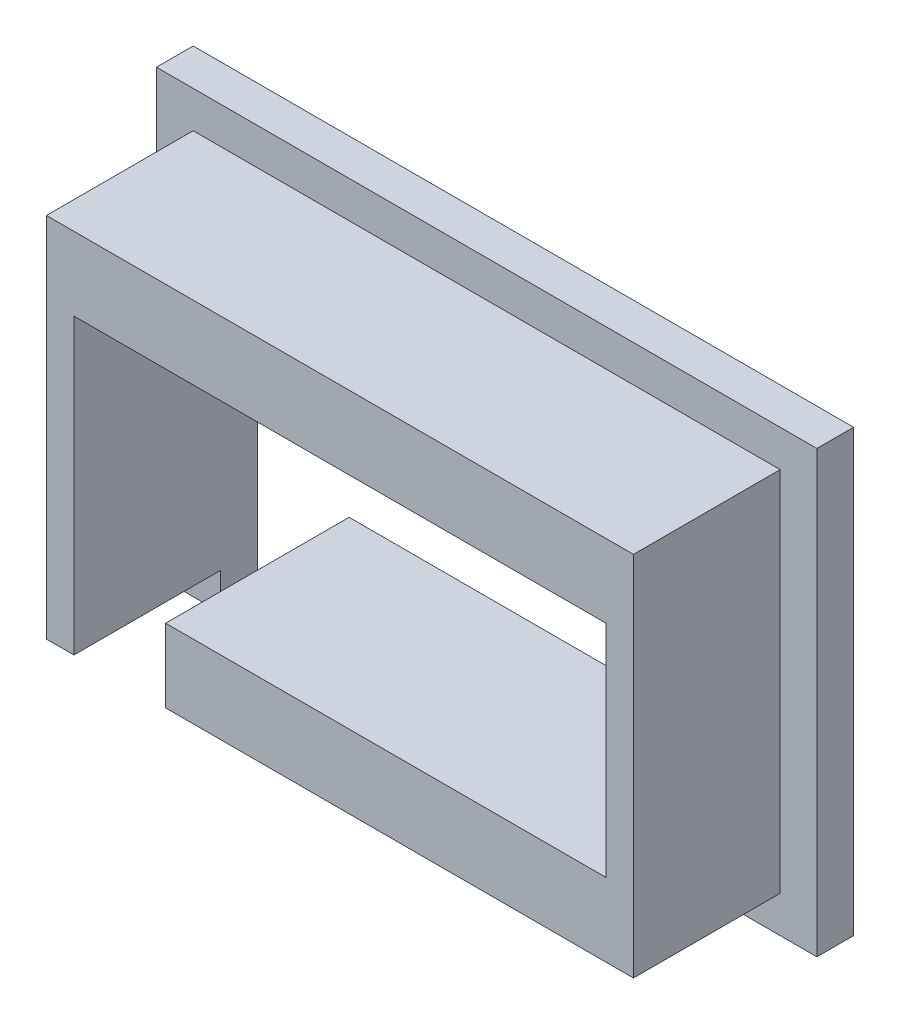
ISO-10303-21;
HEADER;
FILE_DESCRIPTION(('STEP AP214'),'2;1');
FILE_NAME('part.step','',(''),(''),'','','');
FILE_SCHEMA(('AUTOMOTIVE_DESIGN { 1 0 10303 214 1 1 1 1 }'));
ENDSEC;
DATA;
#1=APPLICATION_CONTEXT('core data for automotive mechanical design processes');
#2=APPLICATION_PROTOCOL_DEFINITION('international standard','automotive_design',2000,#1);
#3=PRODUCT_CONTEXT('',#1,'mechanical');
#4=PRODUCT('Part','Part','',(#3));
#5=PRODUCT_RELATED_PRODUCT_CATEGORY('part','',(#4));
#6=PRODUCT_DEFINITION_FORMATION('','',#4);
#7=PRODUCT_DEFINITION_CONTEXT('part definition',#1,'design');
#8=PRODUCT_DEFINITION('design','',#6,#7);
#9=PRODUCT_DEFINITION_SHAPE('','',#8);
#10=(LENGTH_UNIT() NAMED_UNIT(*) SI_UNIT(.MILLI.,.METRE.));
#11=(NAMED_UNIT(*) PLANE_ANGLE_UNIT() SI_UNIT($,.RADIAN.));
#12=(NAMED_UNIT(*) SI_UNIT($,.STERADIAN.) SOLID_ANGLE_UNIT());
#13=UNCERTAINTY_MEASURE_WITH_UNIT(LENGTH_MEASURE(1.E-05),#10,'distance_accuracy_value','');
#14=(GEOMETRIC_REPRESENTATION_CONTEXT(3) GLOBAL_UNCERTAINTY_ASSIGNED_CONTEXT((#13)) GLOBAL_UNIT_ASSIGNED_CONTEXT((#10,
#11,#12)) REPRESENTATION_CONTEXT('',''));
#15=CARTESIAN_POINT('',(0.,0.,0.));
#16=DIRECTION('',(0.,0.,1.));
#17=DIRECTION('',(1.,0.,0.));
#18=AXIS2_PLACEMENT_3D('',#15,#16,#17);
#19=CARTESIAN_POINT('',(-16.,-10.,10.));
#20=DIRECTION('',(0.,1.,0.));
#21=DIRECTION('',(0.,0.,1.));
#22=AXIS2_PLACEMENT_3D('',#19,#20,#21);
#23=PLANE('',#22);
#24=DIRECTION('',(1.,0.,0.));
#25=VECTOR('',#24,1.);
#26=CARTESIAN_POINT('',(-16.,-10.,2.));
#27=LINE('',#26,#25);
#28=CARTESIAN_POINT('',(-16.,-10.,2.));
#29=VERTEX_POINT('',#28);
#30=CARTESIAN_POINT('',(-14.5,-10.,2.));
#31=VERTEX_POINT('',#30);
#32=EDGE_CURVE('E297',#29,#31,#27,.T.);
#33=ORIENTED_EDGE('',*,*,#32,.T.);
#34=DIRECTION('',(0.,0.,1.));
#35=VECTOR('',#34,1.);
#36=CARTESIAN_POINT('',(-14.5,-10.,10.));
#37=LINE('',#36,#35);
#38=CARTESIAN_POINT('',(-14.5,-10.,10.));
#39=VERTEX_POINT('',#38);
#40=EDGE_CURVE('E84',#31,#39,#37,.T.);
#41=ORIENTED_EDGE('',*,*,#40,.T.);
#42=DIRECTION('',(1.,0.,0.));
#43=VECTOR('',#42,1.);
#44=CARTESIAN_POINT('',(-16.,-10.,10.));
#45=LINE('',#44,#43);
#46=CARTESIAN_POINT('',(-16.,-10.,10.));
#47=VERTEX_POINT('',#46);
#48=EDGE_CURVE('E227',#47,#39,#45,.T.);
#49=ORIENTED_EDGE('',*,*,#48,.F.);
#50=DIRECTION('',(0.,0.,-1.));
#51=VECTOR('',#50,1.);
#52=CARTESIAN_POINT('',(-16.,-10.,10.));
#53=LINE('',#52,#51);
#54=EDGE_CURVE('E232',#47,#29,#53,.T.);
#55=ORIENTED_EDGE('',*,*,#54,.T.);
#56=EDGE_LOOP('',(#33,#41,#49,#55));
#57=FACE_BOUND('',#56,.T.);
#58=ADVANCED_FACE('F61',(#57),#23,.F.);
#59=CARTESIAN_POINT('',(-18.,-12.,2.));
#60=DIRECTION('',(0.,1.,0.));
#61=DIRECTION('',(0.,0.,1.));
#62=AXIS2_PLACEMENT_3D('',#59,#60,#61);
#63=PLANE('',#62);
#64=DIRECTION('',(1.,0.,0.));
#65=VECTOR('',#64,1.);
#66=CARTESIAN_POINT('',(-18.,-12.,0.));
#67=LINE('',#66,#65);
#68=CARTESIAN_POINT('',(-18.,-12.,0.));
#69=VERTEX_POINT('',#68);
#70=CARTESIAN_POINT('',(-14.5,-12.,0.));
#71=VERTEX_POINT('',#70);
#72=EDGE_CURVE('E273',#69,#71,#67,.T.);
#73=ORIENTED_EDGE('',*,*,#72,.T.);
#74=DIRECTION('',(0.,0.,-1.));
#75=VECTOR('',#74,1.);
#76=CARTESIAN_POINT('',(-14.5,-12.,10.));
#77=LINE('',#76,#75);
#78=CARTESIAN_POINT('',(-14.5,-12.,2.));
#79=VERTEX_POINT('',#78);
#80=EDGE_CURVE('E303',#79,#71,#77,.T.);
#81=ORIENTED_EDGE('',*,*,#80,.F.);
#82=DIRECTION('',(1.,0.,0.));
#83=VECTOR('',#82,1.);
#84=CARTESIAN_POINT('',(-18.,-12.,2.));
#85=LINE('',#84,#83);
#86=CARTESIAN_POINT('',(-18.,-12.,2.));
#87=VERTEX_POINT('',#86);
#88=EDGE_CURVE('E254',#87,#79,#85,.T.);
#89=ORIENTED_EDGE('',*,*,#88,.F.);
#90=DIRECTION('',(0.,0.,-1.));
#91=VECTOR('',#90,1.);
#92=CARTESIAN_POINT('',(-18.,-12.,2.));
#93=LINE('',#92,#91);
#94=EDGE_CURVE('E209',#87,#69,#93,.T.);
#95=ORIENTED_EDGE('',*,*,#94,.T.);
#96=EDGE_LOOP('',(#73,#81,#89,#95));
#97=FACE_BOUND('',#96,.T.);
#98=ADVANCED_FACE('F325',(#97),#63,.F.);
#99=CARTESIAN_POINT('',(16.,10.,10.));
#100=DIRECTION('',(-1.,0.,0.));
#101=DIRECTION('',(0.,0.,1.));
#102=AXIS2_PLACEMENT_3D('',#99,#100,#101);
#103=PLANE('',#102);
#104=DIRECTION('',(0.,1.,0.));
#105=VECTOR('',#104,1.);
#106=CARTESIAN_POINT('',(16.,-10.,2.));
#107=LINE('',#106,#105);
#108=CARTESIAN_POINT('',(16.,-10.,2.));
#109=VERTEX_POINT('',#108);
#110=CARTESIAN_POINT('',(16.,10.,2.));
#111=VERTEX_POINT('',#110);
#112=EDGE_CURVE('E301',#109,#111,#107,.T.);
#113=ORIENTED_EDGE('',*,*,#112,.T.);
#114=DIRECTION('',(0.,0.,-1.));
#115=VECTOR('',#114,1.);
#116=CARTESIAN_POINT('',(16.,10.,10.));
#117=LINE('',#116,#115);
#118=CARTESIAN_POINT('',(16.,10.,10.));
#119=VERTEX_POINT('',#118);
#120=EDGE_CURVE('E237',#119,#111,#117,.T.);
#121=ORIENTED_EDGE('',*,*,#120,.F.);
#122=DIRECTION('',(0.,1.,0.));
#123=VECTOR('',#122,1.);
#124=CARTESIAN_POINT('',(16.,10.,10.));
#125=LINE('',#124,#123);
#126=CARTESIAN_POINT('',(16.,-10.,10.));
#127=VERTEX_POINT('',#126);
#128=EDGE_CURVE('E219',#127,#119,#125,.T.);
#129=ORIENTED_EDGE('',*,*,#128,.F.);
#130=DIRECTION('',(0.,0.,-1.));
#131=VECTOR('',#130,1.);
#132=CARTESIAN_POINT('',(16.,-10.,10.));
#133=LINE('',#132,#131);
#134=EDGE_CURVE('E229',#127,#109,#133,.T.);
#135=ORIENTED_EDGE('',*,*,#134,.T.);
#136=EDGE_LOOP('',(#113,#121,#129,#135));
#137=FACE_BOUND('',#136,.T.);
#138=ADVANCED_FACE('F63',(#137),#103,.F.);
#139=CARTESIAN_POINT('',(-16.,10.,10.));
#140=DIRECTION('',(0.,-1.,0.));
#141=DIRECTION('',(0.,0.,-1.));
#142=AXIS2_PLACEMENT_3D('',#139,#140,#141);
#143=PLANE('',#142);
#144=DIRECTION('',(1.,0.,0.));
#145=VECTOR('',#144,1.);
#146=CARTESIAN_POINT('',(-16.,10.,2.));
#147=LINE('',#146,#145);
#148=CARTESIAN_POINT('',(-16.,10.,2.));
#149=VERTEX_POINT('',#148);
#150=EDGE_CURVE('E298',#149,#111,#147,.T.);
#151=ORIENTED_EDGE('',*,*,#150,.F.);
#152=DIRECTION('',(0.,0.,-1.));
#153=VECTOR('',#152,1.);
#154=CARTESIAN_POINT('',(-16.,10.,10.));
#155=LINE('',#154,#153);
#156=CARTESIAN_POINT('',(-16.,10.,10.));
#157=VERTEX_POINT('',#156);
#158=EDGE_CURVE('E234',#157,#149,#155,.T.);
#159=ORIENTED_EDGE('',*,*,#158,.F.);
#160=DIRECTION('',(-1.,0.,0.));
#161=VECTOR('',#160,1.);
#162=CARTESIAN_POINT('',(-16.,10.,10.));
#163=LINE('',#162,#161);
#164=EDGE_CURVE('E222',#119,#157,#163,.T.);
#165=ORIENTED_EDGE('',*,*,#164,.F.);
#166=ORIENTED_EDGE('',*,*,#120,.T.);
#167=EDGE_LOOP('',(#151,#159,#165,#166));
#168=FACE_BOUND('',#167,.T.);
#169=ADVANCED_FACE('F356',(#168),#143,.F.);
#170=CARTESIAN_POINT('',(-16.,10.,10.));
#171=DIRECTION('',(1.,0.,0.));
#172=DIRECTION('',(0.,1.,0.));
#173=AXIS2_PLACEMENT_3D('',#170,#171,#172);
#174=PLANE('',#173);
#175=DIRECTION('',(0.,1.,0.));
#176=VECTOR('',#175,1.);
#177=CARTESIAN_POINT('',(-16.,-10.,2.));
#178=LINE('',#177,#176);
#179=EDGE_CURVE('E266',#29,#149,#178,.T.);
#180=ORIENTED_EDGE('',*,*,#179,.F.);
#181=ORIENTED_EDGE('',*,*,#54,.F.);
#182=DIRECTION('',(0.,-1.,0.));
#183=VECTOR('',#182,1.);
#184=CARTESIAN_POINT('',(-16.,10.,10.));
#185=LINE('',#184,#183);
#186=EDGE_CURVE('E224',#157,#47,#185,.T.);
#187=ORIENTED_EDGE('',*,*,#186,.F.);
#188=ORIENTED_EDGE('',*,*,#158,.T.);
#189=EDGE_LOOP('',(#180,#181,#187,#188));
#190=FACE_BOUND('',#189,.T.);
#191=ADVANCED_FACE('F350',(#190),#174,.F.);
#192=CARTESIAN_POINT('',(-9.5,-10.,10.));
#193=VERTEX_POINT('',#192);
#194=EDGE_CURVE('E226',#193,#127,#45,.T.);
#195=ORIENTED_EDGE('',*,*,#194,.F.);
#196=DIRECTION('',(0.,0.,-1.));
#197=VECTOR('',#196,1.);
#198=CARTESIAN_POINT('',(-9.5,-10.,10.));
#199=LINE('',#198,#197);
#200=CARTESIAN_POINT('',(-9.5,-10.,2.));
#201=VERTEX_POINT('',#200);
#202=EDGE_CURVE('E177',#193,#201,#199,.T.);
#203=ORIENTED_EDGE('',*,*,#202,.T.);
#204=EDGE_CURVE('E247',#201,#109,#27,.T.);
#205=ORIENTED_EDGE('',*,*,#204,.T.);
#206=ORIENTED_EDGE('',*,*,#134,.F.);
#207=EDGE_LOOP('',(#195,#203,#205,#206));
#208=FACE_BOUND('',#207,.T.);
#209=ADVANCED_FACE('F343',(#208),#23,.F.);
#210=CARTESIAN_POINT('',(0.,0.,10.));
#211=DIRECTION('',(0.,0.,1.));
#212=DIRECTION('',(1.,0.,0.));
#213=AXIS2_PLACEMENT_3D('',#210,#211,#212);
#214=PLANE('',#213);
#215=ORIENTED_EDGE('',*,*,#48,.T.);
#216=DIRECTION('',(0.,-1.,0.));
#217=VECTOR('',#216,1.);
#218=CARTESIAN_POINT('',(-14.5,6.,10.));
#219=LINE('',#218,#217);
#220=CARTESIAN_POINT('',(-14.5,6.,10.));
#221=VERTEX_POINT('',#220);
#222=EDGE_CURVE('E197',#221,#39,#219,.T.);
#223=ORIENTED_EDGE('',*,*,#222,.F.);
#224=DIRECTION('',(-1.,0.,0.));
#225=VECTOR('',#224,1.);
#226=CARTESIAN_POINT('',(-14.5,6.,10.));
#227=LINE('',#226,#225);
#228=CARTESIAN_POINT('',(14.5,6.,10.));
#229=VERTEX_POINT('',#228);
#230=EDGE_CURVE('E201',#229,#221,#227,.T.);
#231=ORIENTED_EDGE('',*,*,#230,.F.);
#232=DIRECTION('',(0.,1.,0.));
#233=VECTOR('',#232,1.);
#234=CARTESIAN_POINT('',(14.5,6.,10.));
#235=LINE('',#234,#233);
#236=CARTESIAN_POINT('',(14.5,-6.,10.));
#237=VERTEX_POINT('',#236);
#238=EDGE_CURVE('E195',#237,#229,#235,.T.);
#239=ORIENTED_EDGE('',*,*,#238,.F.);
#240=DIRECTION('',(1.,0.,0.));
#241=VECTOR('',#240,1.);
#242=CARTESIAN_POINT('',(-14.5,-6.,10.));
#243=LINE('',#242,#241);
#244=CARTESIAN_POINT('',(-9.5,-6.,10.));
#245=VERTEX_POINT('',#244);
#246=EDGE_CURVE('E187',#245,#237,#243,.T.);
#247=ORIENTED_EDGE('',*,*,#246,.F.);
#248=DIRECTION('',(0.,-1.,0.));
#249=VECTOR('',#248,1.);
#250=CARTESIAN_POINT('',(-9.5,-12.,10.));
#251=LINE('',#250,#249);
#252=EDGE_CURVE('E171',#245,#193,#251,.T.);
#253=ORIENTED_EDGE('',*,*,#252,.T.);
#254=ORIENTED_EDGE('',*,*,#194,.T.);
#255=ORIENTED_EDGE('',*,*,#128,.T.);
#256=ORIENTED_EDGE('',*,*,#164,.T.);
#257=ORIENTED_EDGE('',*,*,#186,.T.);
#258=EDGE_LOOP('',(#215,#223,#231,#239,#247,#253,#254,#255,#256,#257));
#259=FACE_BOUND('',#258,.T.);
#260=ADVANCED_FACE('F193',(#259),#214,.T.);
#261=CARTESIAN_POINT('',(0.,0.,0.));
#262=DIRECTION('',(0.,0.,1.));
#263=DIRECTION('',(1.,0.,0.));
#264=AXIS2_PLACEMENT_3D('',#261,#262,#263);
#265=PLANE('',#264);
#266=DIRECTION('',(0.,-1.,0.));
#267=VECTOR('',#266,1.);
#268=CARTESIAN_POINT('',(-14.5,6.,0.));
#269=LINE('',#268,#267);
#270=CARTESIAN_POINT('',(-14.5,6.,0.));
#271=VERTEX_POINT('',#270);
#272=EDGE_CURVE('E212',#271,#71,#269,.T.);
#273=ORIENTED_EDGE('',*,*,#272,.T.);
#274=ORIENTED_EDGE('',*,*,#72,.F.);
#275=DIRECTION('',(0.,1.,0.));
#276=VECTOR('',#275,1.);
#277=CARTESIAN_POINT('',(-18.,-12.,0.));
#278=LINE('',#277,#276);
#279=CARTESIAN_POINT('',(-18.,12.,0.));
#280=VERTEX_POINT('',#279);
#281=EDGE_CURVE('E262',#69,#280,#278,.T.);
#282=ORIENTED_EDGE('',*,*,#281,.T.);
#283=DIRECTION('',(1.,0.,0.));
#284=VECTOR('',#283,1.);
#285=CARTESIAN_POINT('',(-18.,12.,0.));
#286=LINE('',#285,#284);
#287=CARTESIAN_POINT('',(18.,12.,0.));
#288=VERTEX_POINT('',#287);
#289=EDGE_CURVE('E265',#280,#288,#286,.T.);
#290=ORIENTED_EDGE('',*,*,#289,.T.);
#291=DIRECTION('',(0.,1.,0.));
#292=VECTOR('',#291,1.);
#293=CARTESIAN_POINT('',(18.,-12.,0.));
#294=LINE('',#293,#292);
#295=CARTESIAN_POINT('',(18.,-12.,0.));
#296=VERTEX_POINT('',#295);
#297=EDGE_CURVE('E269',#296,#288,#294,.T.);
#298=ORIENTED_EDGE('',*,*,#297,.F.);
#299=CARTESIAN_POINT('',(-9.5,-12.,0.));
#300=VERTEX_POINT('',#299);
#301=EDGE_CURVE('E272',#300,#296,#67,.T.);
#302=ORIENTED_EDGE('',*,*,#301,.F.);
#303=DIRECTION('',(0.,-1.,0.));
#304=VECTOR('',#303,1.);
#305=CARTESIAN_POINT('',(-9.5,-12.,0.));
#306=LINE('',#305,#304);
#307=CARTESIAN_POINT('',(-9.5,-6.,0.));
#308=VERTEX_POINT('',#307);
#309=EDGE_CURVE('E181',#308,#300,#306,.T.);
#310=ORIENTED_EDGE('',*,*,#309,.F.);
#311=DIRECTION('',(1.,0.,0.));
#312=VECTOR('',#311,1.);
#313=CARTESIAN_POINT('',(-14.5,-6.,0.));
#314=LINE('',#313,#312);
#315=CARTESIAN_POINT('',(14.5,-6.,0.));
#316=VERTEX_POINT('',#315);
#317=EDGE_CURVE('E189',#308,#316,#314,.T.);
#318=ORIENTED_EDGE('',*,*,#317,.T.);
#319=DIRECTION('',(0.,1.,0.));
#320=VECTOR('',#319,1.);
#321=CARTESIAN_POINT('',(14.5,6.,0.));
#322=LINE('',#321,#320);
#323=CARTESIAN_POINT('',(14.5,6.,0.));
#324=VERTEX_POINT('',#323);
#325=EDGE_CURVE('E205',#316,#324,#322,.T.);
#326=ORIENTED_EDGE('',*,*,#325,.T.);
#327=DIRECTION('',(-1.,0.,0.));
#328=VECTOR('',#327,1.);
#329=CARTESIAN_POINT('',(-14.5,6.,0.));
#330=LINE('',#329,#328);
#331=EDGE_CURVE('E208',#324,#271,#330,.T.);
#332=ORIENTED_EDGE('',*,*,#331,.T.);
#333=EDGE_LOOP('',(#273,#274,#282,#290,#298,#302,#310,#318,#326,#332));
#334=FACE_BOUND('',#333,.T.);
#335=ADVANCED_FACE('F328',(#334),#265,.F.);
#336=CARTESIAN_POINT('',(14.5,6.,10.));
#337=DIRECTION('',(-1.,0.,0.));
#338=DIRECTION('',(0.,0.,1.));
#339=AXIS2_PLACEMENT_3D('',#336,#337,#338);
#340=PLANE('',#339);
#341=ORIENTED_EDGE('',*,*,#325,.F.);
#342=DIRECTION('',(0.,0.,-1.));
#343=VECTOR('',#342,1.);
#344=CARTESIAN_POINT('',(14.5,-6.,10.));
#345=LINE('',#344,#343);
#346=EDGE_CURVE('E196',#237,#316,#345,.T.);
#347=ORIENTED_EDGE('',*,*,#346,.F.);
#348=ORIENTED_EDGE('',*,*,#238,.T.);
#349=DIRECTION('',(0.,0.,-1.));
#350=VECTOR('',#349,1.);
#351=CARTESIAN_POINT('',(14.5,6.,10.));
#352=LINE('',#351,#350);
#353=EDGE_CURVE('E216',#229,#324,#352,.T.);
#354=ORIENTED_EDGE('',*,*,#353,.T.);
#355=EDGE_LOOP('',(#341,#347,#348,#354));
#356=FACE_BOUND('',#355,.T.);
#357=ADVANCED_FACE('F331',(#356),#340,.T.);
#358=CARTESIAN_POINT('',(-14.5,6.,10.));
#359=DIRECTION('',(0.,-1.,0.));
#360=DIRECTION('',(0.,0.,-1.));
#361=AXIS2_PLACEMENT_3D('',#358,#359,#360);
#362=PLANE('',#361);
#363=ORIENTED_EDGE('',*,*,#331,.F.);
#364=ORIENTED_EDGE('',*,*,#353,.F.);
#365=ORIENTED_EDGE('',*,*,#230,.T.);
#366=DIRECTION('',(0.,0.,-1.));
#367=VECTOR('',#366,1.);
#368=CARTESIAN_POINT('',(-14.5,6.,10.));
#369=LINE('',#368,#367);
#370=EDGE_CURVE('E199',#221,#271,#369,.T.);
#371=ORIENTED_EDGE('',*,*,#370,.T.);
#372=EDGE_LOOP('',(#363,#364,#365,#371));
#373=FACE_BOUND('',#372,.T.);
#374=ADVANCED_FACE('F285',(#373),#362,.T.);
#375=CARTESIAN_POINT('',(-14.5,6.,10.));
#376=DIRECTION('',(1.,0.,0.));
#377=DIRECTION('',(0.,0.,-1.));
#378=AXIS2_PLACEMENT_3D('',#375,#376,#377);
#379=PLANE('',#378);
#380=ORIENTED_EDGE('',*,*,#272,.F.);
#381=ORIENTED_EDGE('',*,*,#370,.F.);
#382=ORIENTED_EDGE('',*,*,#222,.T.);
#383=ORIENTED_EDGE('',*,*,#40,.F.);
#384=DIRECTION('',(0.,1.,0.));
#385=VECTOR('',#384,1.);
#386=CARTESIAN_POINT('',(-14.5,0.,2.));
#387=LINE('',#386,#385);
#388=EDGE_CURVE('E12',#79,#31,#387,.T.);
#389=ORIENTED_EDGE('',*,*,#388,.F.);
#390=ORIENTED_EDGE('',*,*,#80,.T.);
#391=EDGE_LOOP('',(#380,#381,#382,#383,#389,#390));
#392=FACE_BOUND('',#391,.T.);
#393=ADVANCED_FACE('F288',(#392),#379,.T.);
#394=CARTESIAN_POINT('',(-14.5,-6.,10.));
#395=DIRECTION('',(0.,1.,0.));
#396=DIRECTION('',(0.,0.,1.));
#397=AXIS2_PLACEMENT_3D('',#394,#395,#396);
#398=PLANE('',#397);
#399=DIRECTION('',(0.,0.,-1.));
#400=VECTOR('',#399,1.);
#401=CARTESIAN_POINT('',(-9.5,-6.,10.));
#402=LINE('',#401,#400);
#403=EDGE_CURVE('E174',#245,#308,#402,.T.);
#404=ORIENTED_EDGE('',*,*,#403,.F.);
#405=ORIENTED_EDGE('',*,*,#246,.T.);
#406=ORIENTED_EDGE('',*,*,#346,.T.);
#407=ORIENTED_EDGE('',*,*,#317,.F.);
#408=EDGE_LOOP('',(#404,#405,#406,#407));
#409=FACE_BOUND('',#408,.T.);
#410=ADVANCED_FACE('F185',(#409),#398,.T.);
#411=CARTESIAN_POINT('',(-18.,-12.,2.));
#412=DIRECTION('',(-1.,0.,0.));
#413=DIRECTION('',(0.,0.,1.));
#414=AXIS2_PLACEMENT_3D('',#411,#412,#413);
#415=PLANE('',#414);
#416=ORIENTED_EDGE('',*,*,#281,.F.);
#417=ORIENTED_EDGE('',*,*,#94,.F.);
#418=DIRECTION('',(0.,1.,0.));
#419=VECTOR('',#418,1.);
#420=CARTESIAN_POINT('',(-18.,-12.,2.));
#421=LINE('',#420,#419);
#422=CARTESIAN_POINT('',(-18.,12.,2.));
#423=VERTEX_POINT('',#422);
#424=EDGE_CURVE('E276',#87,#423,#421,.T.);
#425=ORIENTED_EDGE('',*,*,#424,.T.);
#426=DIRECTION('',(0.,0.,-1.));
#427=VECTOR('',#426,1.);
#428=CARTESIAN_POINT('',(-18.,12.,2.));
#429=LINE('',#428,#427);
#430=EDGE_CURVE('E257',#423,#280,#429,.T.);
#431=ORIENTED_EDGE('',*,*,#430,.T.);
#432=EDGE_LOOP('',(#416,#417,#425,#431));
#433=FACE_BOUND('',#432,.T.);
#434=ADVANCED_FACE('F320',(#433),#415,.T.);
#435=CARTESIAN_POINT('',(-9.5,-12.,2.));
#436=VERTEX_POINT('',#435);
#437=CARTESIAN_POINT('',(18.,-12.,2.));
#438=VERTEX_POINT('',#437);
#439=EDGE_CURVE('E244',#436,#438,#85,.T.);
#440=ORIENTED_EDGE('',*,*,#439,.F.);
#441=DIRECTION('',(0.,0.,-1.));
#442=VECTOR('',#441,1.);
#443=CARTESIAN_POINT('',(-9.5,-12.,10.));
#444=LINE('',#443,#442);
#445=EDGE_CURVE('E76',#436,#300,#444,.T.);
#446=ORIENTED_EDGE('',*,*,#445,.T.);
#447=ORIENTED_EDGE('',*,*,#301,.T.);
#448=DIRECTION('',(0.,0.,-1.));
#449=VECTOR('',#448,1.);
#450=CARTESIAN_POINT('',(18.,-12.,2.));
#451=LINE('',#450,#449);
#452=EDGE_CURVE('E252',#438,#296,#451,.T.);
#453=ORIENTED_EDGE('',*,*,#452,.F.);
#454=EDGE_LOOP('',(#440,#446,#447,#453));
#455=FACE_BOUND('',#454,.T.);
#456=ADVANCED_FACE('F249',(#455),#63,.F.);
#457=CARTESIAN_POINT('',(18.,-12.,2.));
#458=DIRECTION('',(-1.,0.,0.));
#459=DIRECTION('',(0.,-1.,0.));
#460=AXIS2_PLACEMENT_3D('',#457,#458,#459);
#461=PLANE('',#460);
#462=ORIENTED_EDGE('',*,*,#297,.T.);
#463=DIRECTION('',(0.,0.,-1.));
#464=VECTOR('',#463,1.);
#465=CARTESIAN_POINT('',(18.,12.,2.));
#466=LINE('',#465,#464);
#467=CARTESIAN_POINT('',(18.,12.,2.));
#468=VERTEX_POINT('',#467);
#469=EDGE_CURVE('E279',#468,#288,#466,.T.);
#470=ORIENTED_EDGE('',*,*,#469,.F.);
#471=DIRECTION('',(0.,1.,0.));
#472=VECTOR('',#471,1.);
#473=CARTESIAN_POINT('',(18.,-12.,2.));
#474=LINE('',#473,#472);
#475=EDGE_CURVE('E255',#438,#468,#474,.T.);
#476=ORIENTED_EDGE('',*,*,#475,.F.);
#477=ORIENTED_EDGE('',*,*,#452,.T.);
#478=EDGE_LOOP('',(#462,#470,#476,#477));
#479=FACE_BOUND('',#478,.T.);
#480=ADVANCED_FACE('F430',(#479),#461,.F.);
#481=CARTESIAN_POINT('',(-18.,12.,2.));
#482=DIRECTION('',(0.,1.,0.));
#483=DIRECTION('',(-1.,0.,0.));
#484=AXIS2_PLACEMENT_3D('',#481,#482,#483);
#485=PLANE('',#484);
#486=ORIENTED_EDGE('',*,*,#289,.F.);
#487=ORIENTED_EDGE('',*,*,#430,.F.);
#488=DIRECTION('',(1.,0.,0.));
#489=VECTOR('',#488,1.);
#490=CARTESIAN_POINT('',(-18.,12.,2.));
#491=LINE('',#490,#489);
#492=EDGE_CURVE('E258',#423,#468,#491,.T.);
#493=ORIENTED_EDGE('',*,*,#492,.T.);
#494=ORIENTED_EDGE('',*,*,#469,.T.);
#495=EDGE_LOOP('',(#486,#487,#493,#494));
#496=FACE_BOUND('',#495,.T.);
#497=ADVANCED_FACE('F315',(#496),#485,.T.);
#498=CARTESIAN_POINT('',(0.,0.,2.));
#499=DIRECTION('',(0.,0.,-1.));
#500=DIRECTION('',(-1.,0.,0.));
#501=AXIS2_PLACEMENT_3D('',#498,#499,#500);
#502=PLANE('',#501);
#503=ORIENTED_EDGE('',*,*,#88,.T.);
#504=ORIENTED_EDGE('',*,*,#388,.T.);
#505=ORIENTED_EDGE('',*,*,#32,.F.);
#506=ORIENTED_EDGE('',*,*,#179,.T.);
#507=ORIENTED_EDGE('',*,*,#150,.T.);
#508=ORIENTED_EDGE('',*,*,#112,.F.);
#509=ORIENTED_EDGE('',*,*,#204,.F.);
#510=DIRECTION('',(0.,-1.,0.));
#511=VECTOR('',#510,1.);
#512=CARTESIAN_POINT('',(-9.5,0.,2.));
#513=LINE('',#512,#511);
#514=EDGE_CURVE('E69',#201,#436,#513,.T.);
#515=ORIENTED_EDGE('',*,*,#514,.T.);
#516=ORIENTED_EDGE('',*,*,#439,.T.);
#517=ORIENTED_EDGE('',*,*,#475,.T.);
#518=ORIENTED_EDGE('',*,*,#492,.F.);
#519=ORIENTED_EDGE('',*,*,#424,.F.);
#520=EDGE_LOOP('',(#503,#504,#505,#506,#507,#508,#509,#515,#516,#517,#518,#519));
#521=FACE_BOUND('',#520,.T.);
#522=ADVANCED_FACE('F243',(#521),#502,.F.);
#523=CARTESIAN_POINT('',(-9.5,-12.,10.));
#524=DIRECTION('',(1.,0.,0.));
#525=DIRECTION('',(0.,1.,0.));
#526=AXIS2_PLACEMENT_3D('',#523,#524,#525);
#527=PLANE('',#526);
#528=ORIENTED_EDGE('',*,*,#252,.F.);
#529=ORIENTED_EDGE('',*,*,#403,.T.);
#530=ORIENTED_EDGE('',*,*,#309,.T.);
#531=ORIENTED_EDGE('',*,*,#445,.F.);
#532=ORIENTED_EDGE('',*,*,#514,.F.);
#533=ORIENTED_EDGE('',*,*,#202,.F.);
#534=EDGE_LOOP('',(#528,#529,#530,#531,#532,#533));
#535=FACE_BOUND('',#534,.T.);
#536=ADVANCED_FACE('F173',(#535),#527,.F.);
#537=CLOSED_SHELL('',(#58,#98,#138,#169,#191,#209,#260,#335,#357,#374,#393,#410,#434,#456,#480,
#497,#522,#536));
#538=MANIFOLD_SOLID_BREP('B2',#537);
#539=ADVANCED_BREP_SHAPE_REPRESENTATION('',(#18,#538),#14);
#540=SHAPE_DEFINITION_REPRESENTATION(#9,#539);
ENDSEC;
END-ISO-10303-21;
